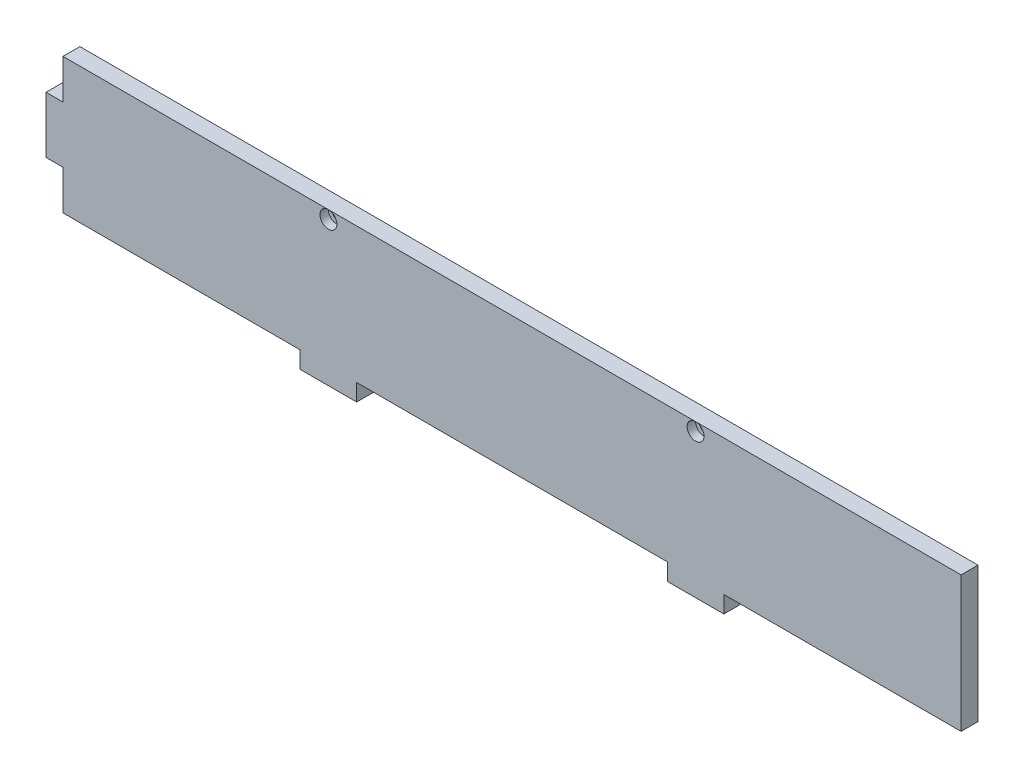
ISO-10303-21;
HEADER;
FILE_DESCRIPTION(('STEP AP214'),'2;1');
FILE_NAME('part.step','',(''),(''),'','','');
FILE_SCHEMA(('AUTOMOTIVE_DESIGN { 1 0 10303 214 1 1 1 1 }'));
ENDSEC;
DATA;
#1=APPLICATION_CONTEXT('core data for automotive mechanical design processes');
#2=APPLICATION_PROTOCOL_DEFINITION('international standard','automotive_design',2000,#1);
#3=PRODUCT_CONTEXT('',#1,'mechanical');
#4=PRODUCT('Part','Part','',(#3));
#5=PRODUCT_RELATED_PRODUCT_CATEGORY('part','',(#4));
#6=PRODUCT_DEFINITION_FORMATION('','',#4);
#7=PRODUCT_DEFINITION_CONTEXT('part definition',#1,'design');
#8=PRODUCT_DEFINITION('design','',#6,#7);
#9=PRODUCT_DEFINITION_SHAPE('','',#8);
#10=(LENGTH_UNIT() NAMED_UNIT(*) SI_UNIT(.MILLI.,.METRE.));
#11=(NAMED_UNIT(*) PLANE_ANGLE_UNIT() SI_UNIT($,.RADIAN.));
#12=(NAMED_UNIT(*) SI_UNIT($,.STERADIAN.) SOLID_ANGLE_UNIT());
#13=UNCERTAINTY_MEASURE_WITH_UNIT(LENGTH_MEASURE(1.E-05),#10,'distance_accuracy_value','');
#14=(GEOMETRIC_REPRESENTATION_CONTEXT(3) GLOBAL_UNCERTAINTY_ASSIGNED_CONTEXT((#13)) GLOBAL_UNIT_ASSIGNED_CONTEXT((#10,
#11,#12)) REPRESENTATION_CONTEXT('',''));
#15=CARTESIAN_POINT('',(0.,0.,0.));
#16=DIRECTION('',(0.,0.,1.));
#17=DIRECTION('',(1.,0.,0.));
#18=AXIS2_PLACEMENT_3D('',#15,#16,#17);
#19=CARTESIAN_POINT('',(-100.,51.0000000000001,0.));
#20=DIRECTION('',(0.,0.,1.));
#21=DIRECTION('',(1.,0.,0.));
#22=AXIS2_PLACEMENT_3D('',#19,#20,#21);
#23=CYLINDRICAL_SURFACE('',#22,1.5);
#24=CARTESIAN_POINT('',(-100.,51.0000000000001,0.));
#25=DIRECTION('',(0.,0.,1.));
#26=DIRECTION('',(1.,0.,0.));
#27=AXIS2_PLACEMENT_3D('',#24,#25,#26);
#28=CIRCLE('',#27,1.5);
#29=CARTESIAN_POINT('',(-98.5,51.0000000000001,0.));
#30=VERTEX_POINT('',#29);
#31=EDGE_CURVE('E186',#30,#30,#28,.T.);
#32=ORIENTED_EDGE('',*,*,#31,.F.);
#33=EDGE_LOOP('',(#32));
#34=FACE_BOUND('',#33,.T.);
#35=CARTESIAN_POINT('',(-100.,51.0000000000001,3.));
#36=DIRECTION('',(0.,0.,1.));
#37=DIRECTION('',(1.,0.,0.));
#38=AXIS2_PLACEMENT_3D('',#35,#36,#37);
#39=CIRCLE('',#38,1.5);
#40=CARTESIAN_POINT('',(-98.5,51.0000000000001,3.));
#41=VERTEX_POINT('',#40);
#42=EDGE_CURVE('E37',#41,#41,#39,.F.);
#43=ORIENTED_EDGE('',*,*,#42,.F.);
#44=EDGE_LOOP('',(#43));
#45=FACE_BOUND('',#44,.T.);
#46=ADVANCED_FACE('F33',(#34,#45),#23,.F.);
#47=CARTESIAN_POINT('',(-230.,51.0000000000001,0.));
#48=DIRECTION('',(0.,0.,1.));
#49=DIRECTION('',(1.,0.,0.));
#50=AXIS2_PLACEMENT_3D('',#47,#48,#49);
#51=CYLINDRICAL_SURFACE('',#50,1.5);
#52=CARTESIAN_POINT('',(-230.,51.0000000000001,0.));
#53=DIRECTION('',(0.,0.,1.));
#54=DIRECTION('',(1.,0.,0.));
#55=AXIS2_PLACEMENT_3D('',#52,#53,#54);
#56=CIRCLE('',#55,1.5);
#57=CARTESIAN_POINT('',(-228.5,51.0000000000001,0.));
#58=VERTEX_POINT('',#57);
#59=EDGE_CURVE('E168',#58,#58,#56,.T.);
#60=ORIENTED_EDGE('',*,*,#59,.F.);
#61=EDGE_LOOP('',(#60));
#62=FACE_BOUND('',#61,.T.);
#63=CARTESIAN_POINT('',(-230.,51.0000000000001,3.));
#64=DIRECTION('',(0.,0.,1.));
#65=DIRECTION('',(1.,0.,0.));
#66=AXIS2_PLACEMENT_3D('',#63,#64,#65);
#67=CIRCLE('',#66,1.5);
#68=CARTESIAN_POINT('',(-228.5,51.0000000000001,3.));
#69=VERTEX_POINT('',#68);
#70=EDGE_CURVE('E184',#69,#69,#67,.F.);
#71=ORIENTED_EDGE('',*,*,#70,.F.);
#72=EDGE_LOOP('',(#71));
#73=FACE_BOUND('',#72,.T.);
#74=ADVANCED_FACE('F357',(#62,#73),#51,.F.);
#75=CARTESIAN_POINT('',(0.,0.,6.));
#76=DIRECTION('',(0.,1.,0.));
#77=DIRECTION('',(0.,0.,1.));
#78=AXIS2_PLACEMENT_3D('',#75,#76,#77);
#79=PLANE('',#78);
#80=DIRECTION('',(1.,0.,0.));
#81=VECTOR('',#80,1.);
#82=CARTESIAN_POINT('',(0.,0.,0.));
#83=LINE('',#82,#81);
#84=CARTESIAN_POINT('',(-240.,0.,0.));
#85=VERTEX_POINT('',#84);
#86=CARTESIAN_POINT('',(-220.,0.,0.));
#87=VERTEX_POINT('',#86);
#88=EDGE_CURVE('E182',#85,#87,#83,.T.);
#89=ORIENTED_EDGE('',*,*,#88,.T.);
#90=DIRECTION('',(0.,0.,1.));
#91=VECTOR('',#90,1.);
#92=CARTESIAN_POINT('',(-220.,0.,0.));
#93=LINE('',#92,#91);
#94=CARTESIAN_POINT('',(-220.,0.,6.));
#95=VERTEX_POINT('',#94);
#96=EDGE_CURVE('E244',#87,#95,#93,.T.);
#97=ORIENTED_EDGE('',*,*,#96,.T.);
#98=DIRECTION('',(1.,0.,0.));
#99=VECTOR('',#98,1.);
#100=CARTESIAN_POINT('',(0.,0.,6.));
#101=LINE('',#100,#99);
#102=CARTESIAN_POINT('',(-240.,0.,6.));
#103=VERTEX_POINT('',#102);
#104=EDGE_CURVE('E11',#103,#95,#101,.T.);
#105=ORIENTED_EDGE('',*,*,#104,.F.);
#106=DIRECTION('',(0.,0.,1.));
#107=VECTOR('',#106,1.);
#108=CARTESIAN_POINT('',(-240.,0.,0.));
#109=LINE('',#108,#107);
#110=EDGE_CURVE('E273',#85,#103,#109,.T.);
#111=ORIENTED_EDGE('',*,*,#110,.F.);
#112=EDGE_LOOP('',(#89,#97,#105,#111));
#113=FACE_BOUND('',#112,.T.);
#114=ADVANCED_FACE('F339',(#113),#79,.F.);
#115=CARTESIAN_POINT('',(0.,54.0000000000001,6.));
#116=DIRECTION('',(0.,-1.,0.));
#117=DIRECTION('',(1.,0.,0.));
#118=AXIS2_PLACEMENT_3D('',#115,#116,#117);
#119=PLANE('',#118);
#120=DIRECTION('',(-1.,0.,0.));
#121=VECTOR('',#120,1.);
#122=CARTESIAN_POINT('',(0.,54.0000000000001,6.));
#123=LINE('',#122,#121);
#124=CARTESIAN_POINT('',(-6.,54.0000000000001,6.));
#125=VERTEX_POINT('',#124);
#126=CARTESIAN_POINT('',(-324.,54.0000000000001,6.));
#127=VERTEX_POINT('',#126);
#128=EDGE_CURVE('E166',#125,#127,#123,.T.);
#129=ORIENTED_EDGE('',*,*,#128,.F.);
#130=DIRECTION('',(0.,0.,1.));
#131=VECTOR('',#130,1.);
#132=CARTESIAN_POINT('',(-6.,54.0000000000001,0.));
#133=LINE('',#132,#131);
#134=CARTESIAN_POINT('',(-6.,54.0000000000001,0.));
#135=VERTEX_POINT('',#134);
#136=EDGE_CURVE('E153',#135,#125,#133,.T.);
#137=ORIENTED_EDGE('',*,*,#136,.F.);
#138=DIRECTION('',(-1.,0.,0.));
#139=VECTOR('',#138,1.);
#140=CARTESIAN_POINT('',(0.,54.0000000000001,0.));
#141=LINE('',#140,#139);
#142=CARTESIAN_POINT('',(-324.,54.0000000000001,0.));
#143=VERTEX_POINT('',#142);
#144=EDGE_CURVE('E165',#135,#143,#141,.T.);
#145=ORIENTED_EDGE('',*,*,#144,.T.);
#146=DIRECTION('',(0.,0.,1.));
#147=VECTOR('',#146,1.);
#148=CARTESIAN_POINT('',(-324.,54.0000000000001,0.));
#149=LINE('',#148,#147);
#150=EDGE_CURVE('E230',#143,#127,#149,.T.);
#151=ORIENTED_EDGE('',*,*,#150,.T.);
#152=EDGE_LOOP('',(#129,#137,#145,#151));
#153=FACE_BOUND('',#152,.T.);
#154=ADVANCED_FACE('F35',(#153),#119,.F.);
#155=CARTESIAN_POINT('',(-330.,0.,6.));
#156=DIRECTION('',(1.,0.,0.));
#157=DIRECTION('',(0.,0.,-1.));
#158=AXIS2_PLACEMENT_3D('',#155,#156,#157);
#159=PLANE('',#158);
#160=DIRECTION('',(0.,-1.,0.));
#161=VECTOR('',#160,1.);
#162=CARTESIAN_POINT('',(-330.,0.,6.));
#163=LINE('',#162,#161);
#164=CARTESIAN_POINT('',(-330.,40.,6.));
#165=VERTEX_POINT('',#164);
#166=CARTESIAN_POINT('',(-330.,20.,6.));
#167=VERTEX_POINT('',#166);
#168=EDGE_CURVE('E290',#165,#167,#163,.T.);
#169=ORIENTED_EDGE('',*,*,#168,.F.);
#170=DIRECTION('',(0.,0.,1.));
#171=VECTOR('',#170,1.);
#172=CARTESIAN_POINT('',(-330.,40.,0.));
#173=LINE('',#172,#171);
#174=CARTESIAN_POINT('',(-330.,40.,0.));
#175=VERTEX_POINT('',#174);
#176=EDGE_CURVE('E225',#175,#165,#173,.T.);
#177=ORIENTED_EDGE('',*,*,#176,.F.);
#178=DIRECTION('',(0.,-1.,0.));
#179=VECTOR('',#178,1.);
#180=CARTESIAN_POINT('',(-330.,0.,0.));
#181=LINE('',#180,#179);
#182=CARTESIAN_POINT('',(-330.,20.,0.));
#183=VERTEX_POINT('',#182);
#184=EDGE_CURVE('E172',#175,#183,#181,.T.);
#185=ORIENTED_EDGE('',*,*,#184,.T.);
#186=DIRECTION('',(0.,0.,1.));
#187=VECTOR('',#186,1.);
#188=CARTESIAN_POINT('',(-330.,20.,0.));
#189=LINE('',#188,#187);
#190=EDGE_CURVE('E173',#183,#167,#189,.T.);
#191=ORIENTED_EDGE('',*,*,#190,.T.);
#192=EDGE_LOOP('',(#169,#177,#185,#191));
#193=FACE_BOUND('',#192,.T.);
#194=ADVANCED_FACE('F318',(#193),#159,.F.);
#195=CARTESIAN_POINT('',(-110.,0.,0.));
#196=VERTEX_POINT('',#195);
#197=CARTESIAN_POINT('',(-90.,0.,0.));
#198=VERTEX_POINT('',#197);
#199=EDGE_CURVE('E175',#196,#198,#83,.T.);
#200=ORIENTED_EDGE('',*,*,#199,.T.);
#201=DIRECTION('',(0.,0.,1.));
#202=VECTOR('',#201,1.);
#203=CARTESIAN_POINT('',(-90.,0.,0.));
#204=LINE('',#203,#202);
#205=CARTESIAN_POINT('',(-90.,0.,6.));
#206=VERTEX_POINT('',#205);
#207=EDGE_CURVE('E214',#198,#206,#204,.T.);
#208=ORIENTED_EDGE('',*,*,#207,.T.);
#209=CARTESIAN_POINT('',(-110.,0.,6.));
#210=VERTEX_POINT('',#209);
#211=EDGE_CURVE('E42',#210,#206,#101,.T.);
#212=ORIENTED_EDGE('',*,*,#211,.F.);
#213=DIRECTION('',(0.,0.,1.));
#214=VECTOR('',#213,1.);
#215=CARTESIAN_POINT('',(-110.,0.,0.));
#216=LINE('',#215,#214);
#217=EDGE_CURVE('E256',#196,#210,#216,.T.);
#218=ORIENTED_EDGE('',*,*,#217,.F.);
#219=EDGE_LOOP('',(#200,#208,#212,#218));
#220=FACE_BOUND('',#219,.T.);
#221=ADVANCED_FACE('F305',(#220),#79,.F.);
#222=CARTESIAN_POINT('',(0.,0.,6.));
#223=DIRECTION('',(0.,0.,1.));
#224=DIRECTION('',(1.,0.,0.));
#225=AXIS2_PLACEMENT_3D('',#222,#223,#224);
#226=PLANE('',#225);
#227=CARTESIAN_POINT('',(-100.,51.0000000000001,6.));
#228=DIRECTION('',(0.,0.,1.));
#229=DIRECTION('',(1.,0.,0.));
#230=AXIS2_PLACEMENT_3D('',#227,#228,#229);
#231=CIRCLE('',#230,2.995);
#232=CARTESIAN_POINT('',(-97.005,51.0000000000001,6.));
#233=VERTEX_POINT('',#232);
#234=EDGE_CURVE('E200',#233,#233,#231,.T.);
#235=ORIENTED_EDGE('',*,*,#234,.F.);
#236=EDGE_LOOP('',(#235));
#237=FACE_BOUND('',#236,.T.);
#238=CARTESIAN_POINT('',(-230.,51.0000000000001,6.));
#239=DIRECTION('',(0.,0.,1.));
#240=DIRECTION('',(1.,0.,0.));
#241=AXIS2_PLACEMENT_3D('',#238,#239,#240);
#242=CIRCLE('',#241,2.995);
#243=CARTESIAN_POINT('',(-227.005,51.0000000000001,6.));
#244=VERTEX_POINT('',#243);
#245=EDGE_CURVE('E193',#244,#244,#242,.T.);
#246=ORIENTED_EDGE('',*,*,#245,.F.);
#247=EDGE_LOOP('',(#246));
#248=FACE_BOUND('',#247,.T.);
#249=DIRECTION('',(0.,-1.,0.));
#250=VECTOR('',#249,1.);
#251=CARTESIAN_POINT('',(-6.00000000000001,6.,6.));
#252=LINE('',#251,#250);
#253=CARTESIAN_POINT('',(-6.00000000000001,6.,6.));
#254=VERTEX_POINT('',#253);
#255=EDGE_CURVE('E167',#125,#254,#252,.T.);
#256=ORIENTED_EDGE('',*,*,#255,.F.);
#257=ORIENTED_EDGE('',*,*,#128,.T.);
#258=DIRECTION('',(0.,1.,0.));
#259=VECTOR('',#258,1.);
#260=CARTESIAN_POINT('',(-324.,40.,6.));
#261=LINE('',#260,#259);
#262=CARTESIAN_POINT('',(-324.,40.,6.));
#263=VERTEX_POINT('',#262);
#264=EDGE_CURVE('E223',#263,#127,#261,.T.);
#265=ORIENTED_EDGE('',*,*,#264,.F.);
#266=DIRECTION('',(1.,0.,0.));
#267=VECTOR('',#266,1.);
#268=CARTESIAN_POINT('',(-330.,40.,6.));
#269=LINE('',#268,#267);
#270=EDGE_CURVE('E217',#165,#263,#269,.T.);
#271=ORIENTED_EDGE('',*,*,#270,.F.);
#272=ORIENTED_EDGE('',*,*,#168,.T.);
#273=DIRECTION('',(-1.,0.,0.));
#274=VECTOR('',#273,1.);
#275=CARTESIAN_POINT('',(-330.,20.,6.));
#276=LINE('',#275,#274);
#277=CARTESIAN_POINT('',(-324.,20.,6.));
#278=VERTEX_POINT('',#277);
#279=EDGE_CURVE('E264',#278,#167,#276,.T.);
#280=ORIENTED_EDGE('',*,*,#279,.F.);
#281=DIRECTION('',(0.,1.,0.));
#282=VECTOR('',#281,1.);
#283=CARTESIAN_POINT('',(-324.,6.,6.));
#284=LINE('',#283,#282);
#285=CARTESIAN_POINT('',(-324.,6.,6.));
#286=VERTEX_POINT('',#285);
#287=EDGE_CURVE('E279',#286,#278,#284,.T.);
#288=ORIENTED_EDGE('',*,*,#287,.F.);
#289=DIRECTION('',(-1.,0.,0.));
#290=VECTOR('',#289,1.);
#291=CARTESIAN_POINT('',(-324.,6.,6.));
#292=LINE('',#291,#290);
#293=CARTESIAN_POINT('',(-240.,6.,6.));
#294=VERTEX_POINT('',#293);
#295=EDGE_CURVE('E276',#294,#286,#292,.T.);
#296=ORIENTED_EDGE('',*,*,#295,.F.);
#297=DIRECTION('',(0.,1.,0.));
#298=VECTOR('',#297,1.);
#299=CARTESIAN_POINT('',(-240.,6.,6.));
#300=LINE('',#299,#298);
#301=EDGE_CURVE('E253',#103,#294,#300,.T.);
#302=ORIENTED_EDGE('',*,*,#301,.F.);
#303=ORIENTED_EDGE('',*,*,#104,.T.);
#304=DIRECTION('',(0.,-1.,0.));
#305=VECTOR('',#304,1.);
#306=CARTESIAN_POINT('',(-220.,0.,6.));
#307=LINE('',#306,#305);
#308=CARTESIAN_POINT('',(-220.,6.,6.));
#309=VERTEX_POINT('',#308);
#310=EDGE_CURVE('E232',#309,#95,#307,.T.);
#311=ORIENTED_EDGE('',*,*,#310,.F.);
#312=DIRECTION('',(-1.,0.,0.));
#313=VECTOR('',#312,1.);
#314=CARTESIAN_POINT('',(-220.,6.,6.));
#315=LINE('',#314,#313);
#316=CARTESIAN_POINT('',(-110.,6.,6.));
#317=VERTEX_POINT('',#316);
#318=EDGE_CURVE('E240',#317,#309,#315,.T.);
#319=ORIENTED_EDGE('',*,*,#318,.F.);
#320=DIRECTION('',(0.,1.,0.));
#321=VECTOR('',#320,1.);
#322=CARTESIAN_POINT('',(-110.,0.,6.));
#323=LINE('',#322,#321);
#324=EDGE_CURVE('E246',#210,#317,#323,.T.);
#325=ORIENTED_EDGE('',*,*,#324,.F.);
#326=ORIENTED_EDGE('',*,*,#211,.T.);
#327=DIRECTION('',(0.,-1.,0.));
#328=VECTOR('',#327,1.);
#329=CARTESIAN_POINT('',(-90.,6.,6.));
#330=LINE('',#329,#328);
#331=CARTESIAN_POINT('',(-90.,6.,6.));
#332=VERTEX_POINT('',#331);
#333=EDGE_CURVE('E161',#332,#206,#330,.T.);
#334=ORIENTED_EDGE('',*,*,#333,.F.);
#335=DIRECTION('',(-1.,0.,0.));
#336=VECTOR('',#335,1.);
#337=CARTESIAN_POINT('',(-90.,6.,6.));
#338=LINE('',#337,#336);
#339=EDGE_CURVE('E210',#254,#332,#338,.T.);
#340=ORIENTED_EDGE('',*,*,#339,.F.);
#341=EDGE_LOOP('',(#256,#257,#265,#271,#272,#280,#288,#296,#302,#303,#311,#319,#325,#326,#334,#340));
#342=FACE_BOUND('',#341,.T.);
#343=ADVANCED_FACE('F299',(#237,#248,#342),#226,.T.);
#344=CARTESIAN_POINT('',(0.,0.,0.));
#345=DIRECTION('',(0.,0.,1.));
#346=DIRECTION('',(1.,0.,0.));
#347=AXIS2_PLACEMENT_3D('',#344,#345,#346);
#348=PLANE('',#347);
#349=ORIENTED_EDGE('',*,*,#31,.T.);
#350=EDGE_LOOP('',(#349));
#351=FACE_BOUND('',#350,.T.);
#352=ORIENTED_EDGE('',*,*,#59,.T.);
#353=EDGE_LOOP('',(#352));
#354=FACE_BOUND('',#353,.T.);
#355=ORIENTED_EDGE('',*,*,#144,.F.);
#356=DIRECTION('',(0.,-1.,0.));
#357=VECTOR('',#356,1.);
#358=CARTESIAN_POINT('',(-6.00000000000001,6.,0.));
#359=LINE('',#358,#357);
#360=CARTESIAN_POINT('',(-6.00000000000001,6.,0.));
#361=VERTEX_POINT('',#360);
#362=EDGE_CURVE('E149',#135,#361,#359,.T.);
#363=ORIENTED_EDGE('',*,*,#362,.T.);
#364=DIRECTION('',(-1.,0.,0.));
#365=VECTOR('',#364,1.);
#366=CARTESIAN_POINT('',(-90.,6.,0.));
#367=LINE('',#366,#365);
#368=CARTESIAN_POINT('',(-90.,6.,0.));
#369=VERTEX_POINT('',#368);
#370=EDGE_CURVE('E160',#361,#369,#367,.T.);
#371=ORIENTED_EDGE('',*,*,#370,.T.);
#372=DIRECTION('',(0.,-1.,0.));
#373=VECTOR('',#372,1.);
#374=CARTESIAN_POINT('',(-90.,6.,0.));
#375=LINE('',#374,#373);
#376=EDGE_CURVE('E206',#369,#198,#375,.T.);
#377=ORIENTED_EDGE('',*,*,#376,.T.);
#378=ORIENTED_EDGE('',*,*,#199,.F.);
#379=DIRECTION('',(0.,1.,0.));
#380=VECTOR('',#379,1.);
#381=CARTESIAN_POINT('',(-110.,0.,0.));
#382=LINE('',#381,#380);
#383=CARTESIAN_POINT('',(-110.,6.,0.));
#384=VERTEX_POINT('',#383);
#385=EDGE_CURVE('E239',#196,#384,#382,.T.);
#386=ORIENTED_EDGE('',*,*,#385,.T.);
#387=DIRECTION('',(-1.,0.,0.));
#388=VECTOR('',#387,1.);
#389=CARTESIAN_POINT('',(-220.,6.,0.));
#390=LINE('',#389,#388);
#391=CARTESIAN_POINT('',(-220.,6.,0.));
#392=VERTEX_POINT('',#391);
#393=EDGE_CURVE('E58',#384,#392,#390,.T.);
#394=ORIENTED_EDGE('',*,*,#393,.T.);
#395=DIRECTION('',(0.,-1.,0.));
#396=VECTOR('',#395,1.);
#397=CARTESIAN_POINT('',(-220.,0.,0.));
#398=LINE('',#397,#396);
#399=EDGE_CURVE('E236',#392,#87,#398,.T.);
#400=ORIENTED_EDGE('',*,*,#399,.T.);
#401=ORIENTED_EDGE('',*,*,#88,.F.);
#402=DIRECTION('',(0.,1.,0.));
#403=VECTOR('',#402,1.);
#404=CARTESIAN_POINT('',(-240.,6.,0.));
#405=LINE('',#404,#403);
#406=CARTESIAN_POINT('',(-240.,6.,0.));
#407=VERTEX_POINT('',#406);
#408=EDGE_CURVE('E260',#85,#407,#405,.T.);
#409=ORIENTED_EDGE('',*,*,#408,.T.);
#410=DIRECTION('',(-1.,0.,0.));
#411=VECTOR('',#410,1.);
#412=CARTESIAN_POINT('',(-324.,6.,0.));
#413=LINE('',#412,#411);
#414=CARTESIAN_POINT('',(-324.,6.,0.));
#415=VERTEX_POINT('',#414);
#416=EDGE_CURVE('E263',#407,#415,#413,.T.);
#417=ORIENTED_EDGE('',*,*,#416,.T.);
#418=DIRECTION('',(0.,1.,0.));
#419=VECTOR('',#418,1.);
#420=CARTESIAN_POINT('',(-324.,6.,0.));
#421=LINE('',#420,#419);
#422=CARTESIAN_POINT('',(-324.,20.,0.));
#423=VERTEX_POINT('',#422);
#424=EDGE_CURVE('E267',#415,#423,#421,.T.);
#425=ORIENTED_EDGE('',*,*,#424,.T.);
#426=DIRECTION('',(-1.,0.,0.));
#427=VECTOR('',#426,1.);
#428=CARTESIAN_POINT('',(-330.,20.,0.));
#429=LINE('',#428,#427);
#430=EDGE_CURVE('E270',#423,#183,#429,.T.);
#431=ORIENTED_EDGE('',*,*,#430,.T.);
#432=ORIENTED_EDGE('',*,*,#184,.F.);
#433=DIRECTION('',(1.,0.,0.));
#434=VECTOR('',#433,1.);
#435=CARTESIAN_POINT('',(-330.,40.,0.));
#436=LINE('',#435,#434);
#437=CARTESIAN_POINT('',(-324.,40.,0.));
#438=VERTEX_POINT('',#437);
#439=EDGE_CURVE('E221',#175,#438,#436,.T.);
#440=ORIENTED_EDGE('',*,*,#439,.T.);
#441=DIRECTION('',(0.,1.,0.));
#442=VECTOR('',#441,1.);
#443=CARTESIAN_POINT('',(-324.,40.,0.));
#444=LINE('',#443,#442);
#445=EDGE_CURVE('E50',#438,#143,#444,.T.);
#446=ORIENTED_EDGE('',*,*,#445,.T.);
#447=EDGE_LOOP('',(#355,#363,#371,#377,#378,#386,#394,#400,#401,#409,#417,#425,#431,#432,#440,#446));
#448=FACE_BOUND('',#447,.T.);
#449=ADVANCED_FACE('F170',(#351,#354,#448),#348,.F.);
#450=CARTESIAN_POINT('',(-330.,20.,0.));
#451=DIRECTION('',(0.,1.,0.));
#452=DIRECTION('',(0.,0.,1.));
#453=AXIS2_PLACEMENT_3D('',#450,#451,#452);
#454=PLANE('',#453);
#455=ORIENTED_EDGE('',*,*,#279,.T.);
#456=ORIENTED_EDGE('',*,*,#190,.F.);
#457=ORIENTED_EDGE('',*,*,#430,.F.);
#458=DIRECTION('',(0.,0.,1.));
#459=VECTOR('',#458,1.);
#460=CARTESIAN_POINT('',(-324.,20.,0.));
#461=LINE('',#460,#459);
#462=EDGE_CURVE('E178',#423,#278,#461,.T.);
#463=ORIENTED_EDGE('',*,*,#462,.T.);
#464=EDGE_LOOP('',(#455,#456,#457,#463));
#465=FACE_BOUND('',#464,.T.);
#466=ADVANCED_FACE('F323',(#465),#454,.F.);
#467=CARTESIAN_POINT('',(-324.,6.,0.));
#468=DIRECTION('',(1.,0.,0.));
#469=DIRECTION('',(0.,0.,-1.));
#470=AXIS2_PLACEMENT_3D('',#467,#468,#469);
#471=PLANE('',#470);
#472=ORIENTED_EDGE('',*,*,#287,.T.);
#473=ORIENTED_EDGE('',*,*,#462,.F.);
#474=ORIENTED_EDGE('',*,*,#424,.F.);
#475=DIRECTION('',(0.,0.,1.));
#476=VECTOR('',#475,1.);
#477=CARTESIAN_POINT('',(-324.,6.,0.));
#478=LINE('',#477,#476);
#479=EDGE_CURVE('E285',#415,#286,#478,.T.);
#480=ORIENTED_EDGE('',*,*,#479,.T.);
#481=EDGE_LOOP('',(#472,#473,#474,#480));
#482=FACE_BOUND('',#481,.T.);
#483=ADVANCED_FACE('F326',(#482),#471,.F.);
#484=CARTESIAN_POINT('',(-324.,6.,0.));
#485=DIRECTION('',(0.,1.,0.));
#486=DIRECTION('',(0.,0.,1.));
#487=AXIS2_PLACEMENT_3D('',#484,#485,#486);
#488=PLANE('',#487);
#489=ORIENTED_EDGE('',*,*,#295,.T.);
#490=ORIENTED_EDGE('',*,*,#479,.F.);
#491=ORIENTED_EDGE('',*,*,#416,.F.);
#492=DIRECTION('',(0.,0.,1.));
#493=VECTOR('',#492,1.);
#494=CARTESIAN_POINT('',(-240.,6.,0.));
#495=LINE('',#494,#493);
#496=EDGE_CURVE('E287',#407,#294,#495,.T.);
#497=ORIENTED_EDGE('',*,*,#496,.T.);
#498=EDGE_LOOP('',(#489,#490,#491,#497));
#499=FACE_BOUND('',#498,.T.);
#500=ADVANCED_FACE('F332',(#499),#488,.F.);
#501=CARTESIAN_POINT('',(-240.,6.,0.));
#502=DIRECTION('',(1.,0.,0.));
#503=DIRECTION('',(0.,0.,-1.));
#504=AXIS2_PLACEMENT_3D('',#501,#502,#503);
#505=PLANE('',#504);
#506=ORIENTED_EDGE('',*,*,#301,.T.);
#507=ORIENTED_EDGE('',*,*,#496,.F.);
#508=ORIENTED_EDGE('',*,*,#408,.F.);
#509=ORIENTED_EDGE('',*,*,#110,.T.);
#510=EDGE_LOOP('',(#506,#507,#508,#509));
#511=FACE_BOUND('',#510,.T.);
#512=ADVANCED_FACE('F335',(#511),#505,.F.);
#513=CARTESIAN_POINT('',(-220.,0.,0.));
#514=DIRECTION('',(-1.,0.,0.));
#515=DIRECTION('',(0.,0.,1.));
#516=AXIS2_PLACEMENT_3D('',#513,#514,#515);
#517=PLANE('',#516);
#518=ORIENTED_EDGE('',*,*,#310,.T.);
#519=ORIENTED_EDGE('',*,*,#96,.F.);
#520=ORIENTED_EDGE('',*,*,#399,.F.);
#521=DIRECTION('',(0.,0.,1.));
#522=VECTOR('',#521,1.);
#523=CARTESIAN_POINT('',(-220.,6.,0.));
#524=LINE('',#523,#522);
#525=EDGE_CURVE('E251',#392,#309,#524,.T.);
#526=ORIENTED_EDGE('',*,*,#525,.T.);
#527=EDGE_LOOP('',(#518,#519,#520,#526));
#528=FACE_BOUND('',#527,.T.);
#529=ADVANCED_FACE('F342',(#528),#517,.F.);
#530=CARTESIAN_POINT('',(-220.,6.,0.));
#531=DIRECTION('',(0.,1.,0.));
#532=DIRECTION('',(0.,0.,1.));
#533=AXIS2_PLACEMENT_3D('',#530,#531,#532);
#534=PLANE('',#533);
#535=ORIENTED_EDGE('',*,*,#318,.T.);
#536=ORIENTED_EDGE('',*,*,#525,.F.);
#537=ORIENTED_EDGE('',*,*,#393,.F.);
#538=DIRECTION('',(0.,0.,1.));
#539=VECTOR('',#538,1.);
#540=CARTESIAN_POINT('',(-110.,6.,0.));
#541=LINE('',#540,#539);
#542=EDGE_CURVE('E254',#384,#317,#541,.T.);
#543=ORIENTED_EDGE('',*,*,#542,.T.);
#544=EDGE_LOOP('',(#535,#536,#537,#543));
#545=FACE_BOUND('',#544,.T.);
#546=ADVANCED_FACE('F344',(#545),#534,.F.);
#547=CARTESIAN_POINT('',(-110.,0.,0.));
#548=DIRECTION('',(1.,0.,0.));
#549=DIRECTION('',(0.,0.,-1.));
#550=AXIS2_PLACEMENT_3D('',#547,#548,#549);
#551=PLANE('',#550);
#552=ORIENTED_EDGE('',*,*,#324,.T.);
#553=ORIENTED_EDGE('',*,*,#542,.F.);
#554=ORIENTED_EDGE('',*,*,#385,.F.);
#555=ORIENTED_EDGE('',*,*,#217,.T.);
#556=EDGE_LOOP('',(#552,#553,#554,#555));
#557=FACE_BOUND('',#556,.T.);
#558=ADVANCED_FACE('F346',(#557),#551,.F.);
#559=CARTESIAN_POINT('',(-324.,40.,0.));
#560=DIRECTION('',(1.,0.,0.));
#561=DIRECTION('',(0.,0.,-1.));
#562=AXIS2_PLACEMENT_3D('',#559,#560,#561);
#563=PLANE('',#562);
#564=ORIENTED_EDGE('',*,*,#264,.T.);
#565=ORIENTED_EDGE('',*,*,#150,.F.);
#566=ORIENTED_EDGE('',*,*,#445,.F.);
#567=DIRECTION('',(0.,0.,1.));
#568=VECTOR('',#567,1.);
#569=CARTESIAN_POINT('',(-324.,40.,0.));
#570=LINE('',#569,#568);
#571=EDGE_CURVE('E233',#438,#263,#570,.T.);
#572=ORIENTED_EDGE('',*,*,#571,.T.);
#573=EDGE_LOOP('',(#564,#565,#566,#572));
#574=FACE_BOUND('',#573,.T.);
#575=ADVANCED_FACE('F313',(#574),#563,.F.);
#576=CARTESIAN_POINT('',(-330.,40.,0.));
#577=DIRECTION('',(0.,-1.,0.));
#578=DIRECTION('',(0.,0.,-1.));
#579=AXIS2_PLACEMENT_3D('',#576,#577,#578);
#580=PLANE('',#579);
#581=ORIENTED_EDGE('',*,*,#270,.T.);
#582=ORIENTED_EDGE('',*,*,#571,.F.);
#583=ORIENTED_EDGE('',*,*,#439,.F.);
#584=ORIENTED_EDGE('',*,*,#176,.T.);
#585=EDGE_LOOP('',(#581,#582,#583,#584));
#586=FACE_BOUND('',#585,.T.);
#587=ADVANCED_FACE('F315',(#586),#580,.F.);
#588=CARTESIAN_POINT('',(-90.,6.,0.));
#589=DIRECTION('',(-1.,0.,0.));
#590=DIRECTION('',(0.,0.,1.));
#591=AXIS2_PLACEMENT_3D('',#588,#589,#590);
#592=PLANE('',#591);
#593=ORIENTED_EDGE('',*,*,#333,.T.);
#594=ORIENTED_EDGE('',*,*,#207,.F.);
#595=ORIENTED_EDGE('',*,*,#376,.F.);
#596=DIRECTION('',(0.,0.,1.));
#597=VECTOR('',#596,1.);
#598=CARTESIAN_POINT('',(-90.,6.,0.));
#599=LINE('',#598,#597);
#600=EDGE_CURVE('E218',#369,#332,#599,.T.);
#601=ORIENTED_EDGE('',*,*,#600,.T.);
#602=EDGE_LOOP('',(#593,#594,#595,#601));
#603=FACE_BOUND('',#602,.T.);
#604=ADVANCED_FACE('F309',(#603),#592,.F.);
#605=CARTESIAN_POINT('',(-90.,6.,0.));
#606=DIRECTION('',(0.,1.,0.));
#607=DIRECTION('',(0.,0.,1.));
#608=AXIS2_PLACEMENT_3D('',#605,#606,#607);
#609=PLANE('',#608);
#610=ORIENTED_EDGE('',*,*,#339,.T.);
#611=ORIENTED_EDGE('',*,*,#600,.F.);
#612=ORIENTED_EDGE('',*,*,#370,.F.);
#613=DIRECTION('',(0.,0.,1.));
#614=VECTOR('',#613,1.);
#615=CARTESIAN_POINT('',(-6.00000000000001,6.,0.));
#616=LINE('',#615,#614);
#617=EDGE_CURVE('E155',#361,#254,#616,.T.);
#618=ORIENTED_EDGE('',*,*,#617,.T.);
#619=EDGE_LOOP('',(#610,#611,#612,#618));
#620=FACE_BOUND('',#619,.T.);
#621=ADVANCED_FACE('F311',(#620),#609,.F.);
#622=CARTESIAN_POINT('',(-6.00000000000001,6.,0.));
#623=DIRECTION('',(-1.,0.,0.));
#624=DIRECTION('',(0.,-1.,0.));
#625=AXIS2_PLACEMENT_3D('',#622,#623,#624);
#626=PLANE('',#625);
#627=ORIENTED_EDGE('',*,*,#255,.T.);
#628=ORIENTED_EDGE('',*,*,#617,.F.);
#629=ORIENTED_EDGE('',*,*,#362,.F.);
#630=ORIENTED_EDGE('',*,*,#136,.T.);
#631=EDGE_LOOP('',(#627,#628,#629,#630));
#632=FACE_BOUND('',#631,.T.);
#633=ADVANCED_FACE('F152',(#632),#626,.F.);
#634=CARTESIAN_POINT('',(-230.,51.0000000000001,3.));
#635=DIRECTION('',(0.,0.,1.));
#636=DIRECTION('',(1.,0.,0.));
#637=AXIS2_PLACEMENT_3D('',#634,#635,#636);
#638=PLANE('',#637);
#639=CARTESIAN_POINT('',(-230.,51.0000000000001,3.));
#640=DIRECTION('',(0.,0.,1.));
#641=DIRECTION('',(1.,0.,0.));
#642=AXIS2_PLACEMENT_3D('',#639,#640,#641);
#643=CIRCLE('',#642,2.995);
#644=CARTESIAN_POINT('',(-227.005,51.0000000000001,3.));
#645=VERTEX_POINT('',#644);
#646=EDGE_CURVE('E187',#645,#645,#643,.T.);
#647=ORIENTED_EDGE('',*,*,#646,.T.);
#648=EDGE_LOOP('',(#647));
#649=FACE_BOUND('',#648,.T.);
#650=ORIENTED_EDGE('',*,*,#70,.T.);
#651=EDGE_LOOP('',(#650));
#652=FACE_BOUND('',#651,.T.);
#653=ADVANCED_FACE('F376',(#649,#652),#638,.T.);
#654=CARTESIAN_POINT('',(-230.,51.0000000000001,3.));
#655=DIRECTION('',(0.,0.,1.));
#656=DIRECTION('',(1.,0.,0.));
#657=AXIS2_PLACEMENT_3D('',#654,#655,#656);
#658=CYLINDRICAL_SURFACE('',#657,2.995);
#659=ORIENTED_EDGE('',*,*,#646,.F.);
#660=EDGE_LOOP('',(#659));
#661=FACE_BOUND('',#660,.T.);
#662=ORIENTED_EDGE('',*,*,#245,.T.);
#663=EDGE_LOOP('',(#662));
#664=FACE_BOUND('',#663,.T.);
#665=ADVANCED_FACE('F369',(#661,#664),#658,.F.);
#666=CARTESIAN_POINT('',(-100.,51.0000000000001,3.));
#667=DIRECTION('',(0.,0.,1.));
#668=DIRECTION('',(1.,0.,0.));
#669=AXIS2_PLACEMENT_3D('',#666,#667,#668);
#670=PLANE('',#669);
#671=CARTESIAN_POINT('',(-100.,51.0000000000001,3.));
#672=DIRECTION('',(0.,0.,1.));
#673=DIRECTION('',(1.,0.,0.));
#674=AXIS2_PLACEMENT_3D('',#671,#672,#673);
#675=CIRCLE('',#674,2.995);
#676=CARTESIAN_POINT('',(-97.005,51.0000000000001,3.));
#677=VERTEX_POINT('',#676);
#678=EDGE_CURVE('E467',#677,#677,#675,.T.);
#679=ORIENTED_EDGE('',*,*,#678,.T.);
#680=EDGE_LOOP('',(#679));
#681=FACE_BOUND('',#680,.T.);
#682=ORIENTED_EDGE('',*,*,#42,.T.);
#683=EDGE_LOOP('',(#682));
#684=FACE_BOUND('',#683,.T.);
#685=ADVANCED_FACE('F441',(#681,#684),#670,.T.);
#686=CARTESIAN_POINT('',(-100.,51.0000000000001,3.));
#687=DIRECTION('',(0.,0.,1.));
#688=DIRECTION('',(1.,0.,0.));
#689=AXIS2_PLACEMENT_3D('',#686,#687,#688);
#690=CYLINDRICAL_SURFACE('',#689,2.995);
#691=ORIENTED_EDGE('',*,*,#678,.F.);
#692=EDGE_LOOP('',(#691));
#693=FACE_BOUND('',#692,.T.);
#694=ORIENTED_EDGE('',*,*,#234,.T.);
#695=EDGE_LOOP('',(#694));
#696=FACE_BOUND('',#695,.T.);
#697=ADVANCED_FACE('F450',(#693,#696),#690,.F.);
#698=CLOSED_SHELL('',(#46,#74,#114,#154,#194,#221,#343,#449,#466,#483,#500,#512,#529,#546,#558,
#575,#587,#604,#621,#633,#653,#665,#685,#697));
#699=MANIFOLD_SOLID_BREP('B2',#698);
#700=ADVANCED_BREP_SHAPE_REPRESENTATION('',(#18,#699),#14);
#701=SHAPE_DEFINITION_REPRESENTATION(#9,#700);
ENDSEC;
END-ISO-10303-21;
